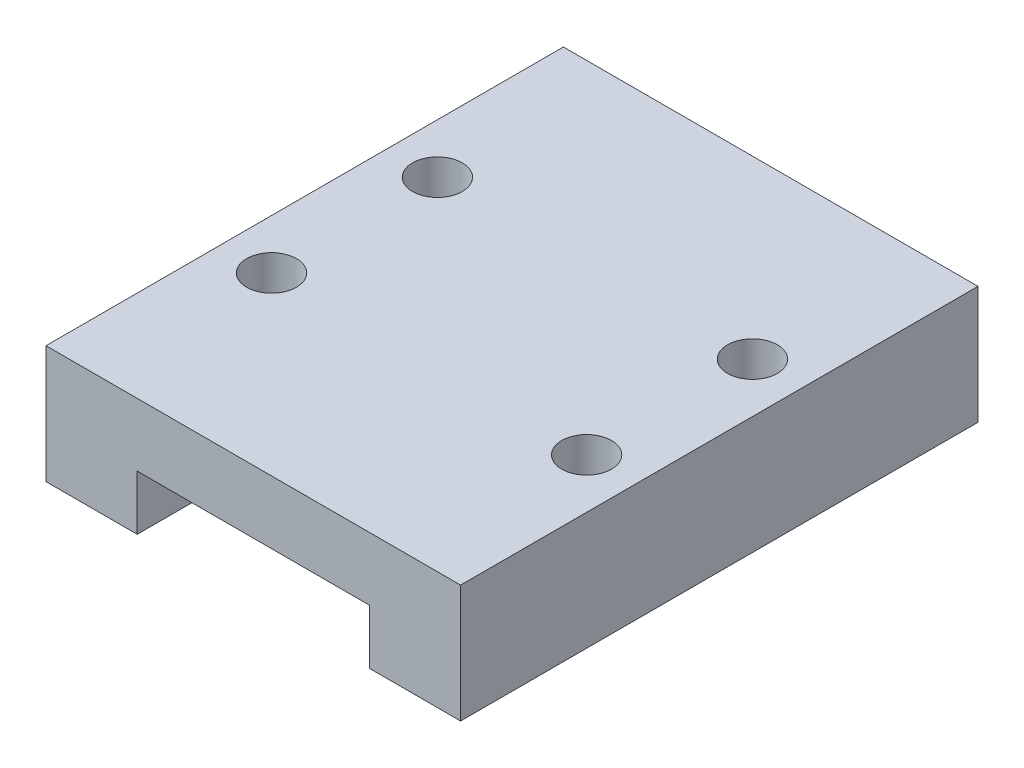
ISO-10303-21;
HEADER;
FILE_DESCRIPTION(('STEP AP214'),'2;1');
FILE_NAME('part.step','',(''),(''),'','','');
FILE_SCHEMA(('AUTOMOTIVE_DESIGN { 1 0 10303 214 1 1 1 1 }'));
ENDSEC;
DATA;
#1=APPLICATION_CONTEXT('core data for automotive mechanical design processes');
#2=APPLICATION_PROTOCOL_DEFINITION('international standard','automotive_design',2000,#1);
#3=PRODUCT_CONTEXT('',#1,'mechanical');
#4=PRODUCT('Part','Part','',(#3));
#5=PRODUCT_RELATED_PRODUCT_CATEGORY('part','',(#4));
#6=PRODUCT_DEFINITION_FORMATION('','',#4);
#7=PRODUCT_DEFINITION_CONTEXT('part definition',#1,'design');
#8=PRODUCT_DEFINITION('design','',#6,#7);
#9=PRODUCT_DEFINITION_SHAPE('','',#8);
#10=(LENGTH_UNIT() NAMED_UNIT(*) SI_UNIT(.MILLI.,.METRE.));
#11=(NAMED_UNIT(*) PLANE_ANGLE_UNIT() SI_UNIT($,.RADIAN.));
#12=(NAMED_UNIT(*) SI_UNIT($,.STERADIAN.) SOLID_ANGLE_UNIT());
#13=UNCERTAINTY_MEASURE_WITH_UNIT(LENGTH_MEASURE(1.E-05),#10,'distance_accuracy_value','');
#14=(GEOMETRIC_REPRESENTATION_CONTEXT(3) GLOBAL_UNCERTAINTY_ASSIGNED_CONTEXT((#13)) GLOBAL_UNIT_ASSIGNED_CONTEXT((#10,
#11,#12)) REPRESENTATION_CONTEXT('',''));
#15=CARTESIAN_POINT('',(0.,0.,0.));
#16=DIRECTION('',(0.,0.,1.));
#17=DIRECTION('',(1.,0.,0.));
#18=AXIS2_PLACEMENT_3D('',#15,#16,#17);
#19=CARTESIAN_POINT('',(-12.5,-3.55,15.6));
#20=DIRECTION('',(0.,1.,0.));
#21=DIRECTION('',(0.,0.,1.));
#22=AXIS2_PLACEMENT_3D('',#19,#20,#21);
#23=PLANE('',#22);
#24=DIRECTION('',(1.,0.,0.));
#25=VECTOR('',#24,1.);
#26=CARTESIAN_POINT('',(-12.5,-3.55,-15.6));
#27=LINE('',#26,#25);
#28=CARTESIAN_POINT('',(-12.5,-3.55,-15.6));
#29=VERTEX_POINT('',#28);
#30=CARTESIAN_POINT('',(-7.,-3.55,-15.6));
#31=VERTEX_POINT('',#30);
#32=EDGE_CURVE('E134',#29,#31,#27,.T.);
#33=ORIENTED_EDGE('',*,*,#32,.T.);
#34=DIRECTION('',(0.,0.,1.));
#35=VECTOR('',#34,1.);
#36=CARTESIAN_POINT('',(-7.,-3.55,-15.6));
#37=LINE('',#36,#35);
#38=CARTESIAN_POINT('',(-7.,-3.55,15.6));
#39=VERTEX_POINT('',#38);
#40=EDGE_CURVE('E116',#31,#39,#37,.T.);
#41=ORIENTED_EDGE('',*,*,#40,.T.);
#42=DIRECTION('',(1.,0.,0.));
#43=VECTOR('',#42,1.);
#44=CARTESIAN_POINT('',(-12.5,-3.55,15.6));
#45=LINE('',#44,#43);
#46=CARTESIAN_POINT('',(-12.5,-3.55,15.6));
#47=VERTEX_POINT('',#46);
#48=EDGE_CURVE('E156',#47,#39,#45,.T.);
#49=ORIENTED_EDGE('',*,*,#48,.F.);
#50=DIRECTION('',(0.,0.,-1.));
#51=VECTOR('',#50,1.);
#52=CARTESIAN_POINT('',(-12.5,-3.55,15.6));
#53=LINE('',#52,#51);
#54=EDGE_CURVE('E142',#47,#29,#53,.T.);
#55=ORIENTED_EDGE('',*,*,#54,.T.);
#56=EDGE_LOOP('',(#33,#41,#49,#55));
#57=FACE_BOUND('',#56,.T.);
#58=ADVANCED_FACE('F39',(#57),#23,.F.);
#59=CARTESIAN_POINT('',(12.5,-3.55,15.6));
#60=DIRECTION('',(-1.,0.,0.));
#61=DIRECTION('',(0.,0.,1.));
#62=AXIS2_PLACEMENT_3D('',#59,#60,#61);
#63=PLANE('',#62);
#64=DIRECTION('',(0.,1.,0.));
#65=VECTOR('',#64,1.);
#66=CARTESIAN_POINT('',(12.5,-3.55,-15.6));
#67=LINE('',#66,#65);
#68=CARTESIAN_POINT('',(12.5,-3.55,-15.6));
#69=VERTEX_POINT('',#68);
#70=CARTESIAN_POINT('',(12.5,3.55,-15.6));
#71=VERTEX_POINT('',#70);
#72=EDGE_CURVE('E168',#69,#71,#67,.T.);
#73=ORIENTED_EDGE('',*,*,#72,.T.);
#74=DIRECTION('',(0.,0.,-1.));
#75=VECTOR('',#74,1.);
#76=CARTESIAN_POINT('',(12.5,3.55,15.6));
#77=LINE('',#76,#75);
#78=CARTESIAN_POINT('',(12.5,3.55,15.6));
#79=VERTEX_POINT('',#78);
#80=EDGE_CURVE('E11',#79,#71,#77,.T.);
#81=ORIENTED_EDGE('',*,*,#80,.F.);
#82=DIRECTION('',(0.,1.,0.));
#83=VECTOR('',#82,1.);
#84=CARTESIAN_POINT('',(12.5,-3.55,15.6));
#85=LINE('',#84,#83);
#86=CARTESIAN_POINT('',(12.5,-3.55,15.6));
#87=VERTEX_POINT('',#86);
#88=EDGE_CURVE('E144',#87,#79,#85,.T.);
#89=ORIENTED_EDGE('',*,*,#88,.F.);
#90=DIRECTION('',(0.,0.,-1.));
#91=VECTOR('',#90,1.);
#92=CARTESIAN_POINT('',(12.5,-3.55,15.6));
#93=LINE('',#92,#91);
#94=EDGE_CURVE('E153',#87,#69,#93,.T.);
#95=ORIENTED_EDGE('',*,*,#94,.T.);
#96=EDGE_LOOP('',(#73,#81,#89,#95));
#97=FACE_BOUND('',#96,.T.);
#98=ADVANCED_FACE('F41',(#97),#63,.F.);
#99=CARTESIAN_POINT('',(-12.5,3.55,15.6));
#100=DIRECTION('',(0.,-1.,0.));
#101=DIRECTION('',(0.,0.,-1.));
#102=AXIS2_PLACEMENT_3D('',#99,#100,#101);
#103=PLANE('',#102);
#104=CARTESIAN_POINT('',(9.5,3.55,-5.));
#105=DIRECTION('',(0.,1.,0.));
#106=DIRECTION('',(0.,0.,1.));
#107=AXIS2_PLACEMENT_3D('',#104,#105,#106);
#108=CIRCLE('',#107,1.5);
#109=CARTESIAN_POINT('',(9.5,3.55,-3.5));
#110=VERTEX_POINT('',#109);
#111=EDGE_CURVE('E208',#110,#110,#108,.T.);
#112=ORIENTED_EDGE('',*,*,#111,.F.);
#113=EDGE_LOOP('',(#112));
#114=FACE_BOUND('',#113,.T.);
#115=CARTESIAN_POINT('',(-9.5,3.55,-5.));
#116=DIRECTION('',(0.,1.,0.));
#117=DIRECTION('',(0.,0.,1.));
#118=AXIS2_PLACEMENT_3D('',#115,#116,#117);
#119=CIRCLE('',#118,1.5);
#120=CARTESIAN_POINT('',(-9.5,3.55,-3.5));
#121=VERTEX_POINT('',#120);
#122=EDGE_CURVE('E216',#121,#121,#119,.T.);
#123=ORIENTED_EDGE('',*,*,#122,.F.);
#124=EDGE_LOOP('',(#123));
#125=FACE_BOUND('',#124,.T.);
#126=CARTESIAN_POINT('',(-9.5,3.55,5.));
#127=DIRECTION('',(0.,1.,0.));
#128=DIRECTION('',(0.,0.,1.));
#129=AXIS2_PLACEMENT_3D('',#126,#127,#128);
#130=CIRCLE('',#129,1.5);
#131=CARTESIAN_POINT('',(-9.5,3.55,6.5));
#132=VERTEX_POINT('',#131);
#133=EDGE_CURVE('E224',#132,#132,#130,.T.);
#134=ORIENTED_EDGE('',*,*,#133,.F.);
#135=EDGE_LOOP('',(#134));
#136=FACE_BOUND('',#135,.T.);
#137=CARTESIAN_POINT('',(9.5,3.55,5.));
#138=DIRECTION('',(0.,1.,0.));
#139=DIRECTION('',(0.,0.,1.));
#140=AXIS2_PLACEMENT_3D('',#137,#138,#139);
#141=CIRCLE('',#140,1.5);
#142=CARTESIAN_POINT('',(9.5,3.55,6.5));
#143=VERTEX_POINT('',#142);
#144=EDGE_CURVE('E200',#143,#143,#141,.T.);
#145=ORIENTED_EDGE('',*,*,#144,.F.);
#146=EDGE_LOOP('',(#145));
#147=FACE_BOUND('',#146,.T.);
#148=DIRECTION('',(-1.,0.,0.));
#149=VECTOR('',#148,1.);
#150=CARTESIAN_POINT('',(-12.5,3.55,-15.6));
#151=LINE('',#150,#149);
#152=CARTESIAN_POINT('',(-12.5,3.55,-15.6));
#153=VERTEX_POINT('',#152);
#154=EDGE_CURVE('E165',#71,#153,#151,.T.);
#155=ORIENTED_EDGE('',*,*,#154,.T.);
#156=DIRECTION('',(0.,0.,-1.));
#157=VECTOR('',#156,1.);
#158=CARTESIAN_POINT('',(-12.5,3.55,15.6));
#159=LINE('',#158,#157);
#160=CARTESIAN_POINT('',(-12.5,3.55,15.6));
#161=VERTEX_POINT('',#160);
#162=EDGE_CURVE('E48',#161,#153,#159,.T.);
#163=ORIENTED_EDGE('',*,*,#162,.F.);
#164=DIRECTION('',(-1.,0.,0.));
#165=VECTOR('',#164,1.);
#166=CARTESIAN_POINT('',(-12.5,3.55,15.6));
#167=LINE('',#166,#165);
#168=EDGE_CURVE('E93',#79,#161,#167,.T.);
#169=ORIENTED_EDGE('',*,*,#168,.F.);
#170=ORIENTED_EDGE('',*,*,#80,.T.);
#171=EDGE_LOOP('',(#155,#163,#169,#170));
#172=FACE_BOUND('',#171,.T.);
#173=ADVANCED_FACE('F241',(#114,#125,#136,#147,#172),#103,.F.);
#174=CARTESIAN_POINT('',(-12.5,-3.55,15.6));
#175=DIRECTION('',(1.,0.,0.));
#176=DIRECTION('',(0.,0.,-1.));
#177=AXIS2_PLACEMENT_3D('',#174,#175,#176);
#178=PLANE('',#177);
#179=DIRECTION('',(0.,-1.,0.));
#180=VECTOR('',#179,1.);
#181=CARTESIAN_POINT('',(-12.5,-3.55,-15.6));
#182=LINE('',#181,#180);
#183=EDGE_CURVE('E149',#153,#29,#182,.T.);
#184=ORIENTED_EDGE('',*,*,#183,.T.);
#185=ORIENTED_EDGE('',*,*,#54,.F.);
#186=DIRECTION('',(0.,-1.,0.));
#187=VECTOR('',#186,1.);
#188=CARTESIAN_POINT('',(-12.5,-3.55,15.6));
#189=LINE('',#188,#187);
#190=EDGE_CURVE('E163',#161,#47,#189,.T.);
#191=ORIENTED_EDGE('',*,*,#190,.F.);
#192=ORIENTED_EDGE('',*,*,#162,.T.);
#193=EDGE_LOOP('',(#184,#185,#191,#192));
#194=FACE_BOUND('',#193,.T.);
#195=ADVANCED_FACE('F162',(#194),#178,.F.);
#196=CARTESIAN_POINT('',(7.,-3.55,15.6));
#197=VERTEX_POINT('',#196);
#198=EDGE_CURVE('E64',#197,#87,#45,.T.);
#199=ORIENTED_EDGE('',*,*,#198,.F.);
#200=DIRECTION('',(0.,0.,1.));
#201=VECTOR('',#200,1.);
#202=CARTESIAN_POINT('',(7.,-3.55,-15.6));
#203=LINE('',#202,#201);
#204=CARTESIAN_POINT('',(7.,-3.55,-15.6));
#205=VERTEX_POINT('',#204);
#206=EDGE_CURVE('E128',#205,#197,#203,.T.);
#207=ORIENTED_EDGE('',*,*,#206,.F.);
#208=EDGE_CURVE('E86',#205,#69,#27,.T.);
#209=ORIENTED_EDGE('',*,*,#208,.T.);
#210=ORIENTED_EDGE('',*,*,#94,.F.);
#211=EDGE_LOOP('',(#199,#207,#209,#210));
#212=FACE_BOUND('',#211,.T.);
#213=ADVANCED_FACE('F265',(#212),#23,.F.);
#214=CARTESIAN_POINT('',(0.,0.,15.6));
#215=DIRECTION('',(0.,0.,-1.));
#216=DIRECTION('',(-1.,0.,0.));
#217=AXIS2_PLACEMENT_3D('',#214,#215,#216);
#218=PLANE('',#217);
#219=ORIENTED_EDGE('',*,*,#48,.T.);
#220=DIRECTION('',(0.,1.,0.));
#221=VECTOR('',#220,1.);
#222=CARTESIAN_POINT('',(-7.,0.,15.6));
#223=LINE('',#222,#221);
#224=CARTESIAN_POINT('',(-7.,-0.25,15.6));
#225=VERTEX_POINT('',#224);
#226=EDGE_CURVE('E122',#39,#225,#223,.T.);
#227=ORIENTED_EDGE('',*,*,#226,.T.);
#228=DIRECTION('',(1.,0.,0.));
#229=VECTOR('',#228,1.);
#230=CARTESIAN_POINT('',(0.,-0.25,15.6));
#231=LINE('',#230,#229);
#232=CARTESIAN_POINT('',(7.,-0.25,15.6));
#233=VERTEX_POINT('',#232);
#234=EDGE_CURVE('E181',#225,#233,#231,.T.);
#235=ORIENTED_EDGE('',*,*,#234,.T.);
#236=DIRECTION('',(0.,-1.,0.));
#237=VECTOR('',#236,1.);
#238=CARTESIAN_POINT('',(7.,0.,15.6));
#239=LINE('',#238,#237);
#240=EDGE_CURVE('E185',#233,#197,#239,.T.);
#241=ORIENTED_EDGE('',*,*,#240,.T.);
#242=ORIENTED_EDGE('',*,*,#198,.T.);
#243=ORIENTED_EDGE('',*,*,#88,.T.);
#244=ORIENTED_EDGE('',*,*,#168,.T.);
#245=ORIENTED_EDGE('',*,*,#190,.T.);
#246=EDGE_LOOP('',(#219,#227,#235,#241,#242,#243,#244,#245));
#247=FACE_BOUND('',#246,.T.);
#248=ADVANCED_FACE('F273',(#247),#218,.F.);
#249=CARTESIAN_POINT('',(0.,0.,-15.6));
#250=DIRECTION('',(0.,0.,-1.));
#251=DIRECTION('',(-1.,0.,0.));
#252=AXIS2_PLACEMENT_3D('',#249,#250,#251);
#253=PLANE('',#252);
#254=DIRECTION('',(0.,-1.,0.));
#255=VECTOR('',#254,1.);
#256=CARTESIAN_POINT('',(-7.,-3.55,-15.6));
#257=LINE('',#256,#255);
#258=CARTESIAN_POINT('',(-7.,-0.25,-15.6));
#259=VERTEX_POINT('',#258);
#260=EDGE_CURVE('E120',#259,#31,#257,.T.);
#261=ORIENTED_EDGE('',*,*,#260,.T.);
#262=ORIENTED_EDGE('',*,*,#32,.F.);
#263=ORIENTED_EDGE('',*,*,#183,.F.);
#264=ORIENTED_EDGE('',*,*,#154,.F.);
#265=ORIENTED_EDGE('',*,*,#72,.F.);
#266=ORIENTED_EDGE('',*,*,#208,.F.);
#267=DIRECTION('',(0.,1.,0.));
#268=VECTOR('',#267,1.);
#269=CARTESIAN_POINT('',(7.,-3.55,-15.6));
#270=LINE('',#269,#268);
#271=CARTESIAN_POINT('',(7.,-0.25,-15.6));
#272=VERTEX_POINT('',#271);
#273=EDGE_CURVE('E137',#205,#272,#270,.T.);
#274=ORIENTED_EDGE('',*,*,#273,.T.);
#275=DIRECTION('',(-1.,0.,0.));
#276=VECTOR('',#275,1.);
#277=CARTESIAN_POINT('',(-7.,-0.25,-15.6));
#278=LINE('',#277,#276);
#279=EDGE_CURVE('E55',#272,#259,#278,.T.);
#280=ORIENTED_EDGE('',*,*,#279,.T.);
#281=EDGE_LOOP('',(#261,#262,#263,#264,#265,#266,#274,#280));
#282=FACE_BOUND('',#281,.T.);
#283=ADVANCED_FACE('F132',(#282),#253,.T.);
#284=CARTESIAN_POINT('',(-7.,-3.55,-15.6));
#285=DIRECTION('',(-1.,0.,0.));
#286=DIRECTION('',(0.,0.,1.));
#287=AXIS2_PLACEMENT_3D('',#284,#285,#286);
#288=PLANE('',#287);
#289=ORIENTED_EDGE('',*,*,#40,.F.);
#290=ORIENTED_EDGE('',*,*,#260,.F.);
#291=DIRECTION('',(0.,0.,1.));
#292=VECTOR('',#291,1.);
#293=CARTESIAN_POINT('',(-7.,-0.25,-15.6));
#294=LINE('',#293,#292);
#295=EDGE_CURVE('E187',#259,#225,#294,.T.);
#296=ORIENTED_EDGE('',*,*,#295,.T.);
#297=ORIENTED_EDGE('',*,*,#226,.F.);
#298=EDGE_LOOP('',(#289,#290,#296,#297));
#299=FACE_BOUND('',#298,.T.);
#300=ADVANCED_FACE('F118',(#299),#288,.F.);
#301=CARTESIAN_POINT('',(-7.,-0.25,-15.6));
#302=DIRECTION('',(0.,1.,0.));
#303=DIRECTION('',(0.,0.,1.));
#304=AXIS2_PLACEMENT_3D('',#301,#302,#303);
#305=PLANE('',#304);
#306=ORIENTED_EDGE('',*,*,#295,.F.);
#307=ORIENTED_EDGE('',*,*,#279,.F.);
#308=DIRECTION('',(0.,0.,1.));
#309=VECTOR('',#308,1.);
#310=CARTESIAN_POINT('',(7.,-0.25,-15.6));
#311=LINE('',#310,#309);
#312=EDGE_CURVE('E191',#272,#233,#311,.T.);
#313=ORIENTED_EDGE('',*,*,#312,.T.);
#314=ORIENTED_EDGE('',*,*,#234,.F.);
#315=EDGE_LOOP('',(#306,#307,#313,#314));
#316=FACE_BOUND('',#315,.T.);
#317=ADVANCED_FACE('F258',(#316),#305,.F.);
#318=CARTESIAN_POINT('',(7.,-3.55,-15.6));
#319=DIRECTION('',(1.,0.,0.));
#320=DIRECTION('',(0.,1.,0.));
#321=AXIS2_PLACEMENT_3D('',#318,#319,#320);
#322=PLANE('',#321);
#323=ORIENTED_EDGE('',*,*,#312,.F.);
#324=ORIENTED_EDGE('',*,*,#273,.F.);
#325=ORIENTED_EDGE('',*,*,#206,.T.);
#326=ORIENTED_EDGE('',*,*,#240,.F.);
#327=EDGE_LOOP('',(#323,#324,#325,#326));
#328=FACE_BOUND('',#327,.T.);
#329=ADVANCED_FACE('F249',(#328),#322,.F.);
#330=CARTESIAN_POINT('',(9.5,0.55,5.));
#331=DIRECTION('',(0.,1.,0.));
#332=DIRECTION('',(0.,0.,1.));
#333=AXIS2_PLACEMENT_3D('',#330,#331,#332);
#334=CYLINDRICAL_SURFACE('',#333,1.5);
#335=CARTESIAN_POINT('',(9.5,0.55,5.));
#336=DIRECTION('',(0.,1.,0.));
#337=DIRECTION('',(0.,0.,1.));
#338=AXIS2_PLACEMENT_3D('',#335,#336,#337);
#339=CIRCLE('',#338,1.5);
#340=CARTESIAN_POINT('',(9.5,0.55,6.5));
#341=VERTEX_POINT('',#340);
#342=EDGE_CURVE('E138',#341,#341,#339,.T.);
#343=ORIENTED_EDGE('',*,*,#342,.F.);
#344=EDGE_LOOP('',(#343));
#345=FACE_BOUND('',#344,.T.);
#346=ORIENTED_EDGE('',*,*,#144,.T.);
#347=EDGE_LOOP('',(#346));
#348=FACE_BOUND('',#347,.T.);
#349=ADVANCED_FACE('F247',(#345,#348),#334,.F.);
#350=CARTESIAN_POINT('',(9.5,0.55,5.));
#351=DIRECTION('',(0.,1.,0.));
#352=DIRECTION('',(0.,0.,1.));
#353=AXIS2_PLACEMENT_3D('',#350,#351,#352);
#354=PLANE('',#353);
#355=ORIENTED_EDGE('',*,*,#342,.T.);
#356=EDGE_LOOP('',(#355));
#357=FACE_BOUND('',#356,.T.);
#358=ADVANCED_FACE('F237',(#357),#354,.T.);
#359=CARTESIAN_POINT('',(-9.5,0.55,5.));
#360=DIRECTION('',(0.,1.,0.));
#361=DIRECTION('',(0.,0.,1.));
#362=AXIS2_PLACEMENT_3D('',#359,#360,#361);
#363=CYLINDRICAL_SURFACE('',#362,1.5);
#364=CARTESIAN_POINT('',(-9.5,0.55,5.));
#365=DIRECTION('',(0.,1.,0.));
#366=DIRECTION('',(0.,0.,1.));
#367=AXIS2_PLACEMENT_3D('',#364,#365,#366);
#368=CIRCLE('',#367,1.5);
#369=CARTESIAN_POINT('',(-9.5,0.55,6.5));
#370=VERTEX_POINT('',#369);
#371=EDGE_CURVE('E204',#370,#370,#368,.T.);
#372=ORIENTED_EDGE('',*,*,#371,.F.);
#373=EDGE_LOOP('',(#372));
#374=FACE_BOUND('',#373,.T.);
#375=ORIENTED_EDGE('',*,*,#133,.T.);
#376=EDGE_LOOP('',(#375));
#377=FACE_BOUND('',#376,.T.);
#378=ADVANCED_FACE('F234',(#374,#377),#363,.F.);
#379=CARTESIAN_POINT('',(-9.5,0.55,5.));
#380=DIRECTION('',(0.,1.,0.));
#381=DIRECTION('',(0.,0.,1.));
#382=AXIS2_PLACEMENT_3D('',#379,#380,#381);
#383=PLANE('',#382);
#384=ORIENTED_EDGE('',*,*,#371,.T.);
#385=EDGE_LOOP('',(#384));
#386=FACE_BOUND('',#385,.T.);
#387=ADVANCED_FACE('F232',(#386),#383,.T.);
#388=CARTESIAN_POINT('',(-9.5,0.55,-5.));
#389=DIRECTION('',(0.,1.,0.));
#390=DIRECTION('',(0.,0.,1.));
#391=AXIS2_PLACEMENT_3D('',#388,#389,#390);
#392=CYLINDRICAL_SURFACE('',#391,1.5);
#393=CARTESIAN_POINT('',(-9.5,0.55,-5.));
#394=DIRECTION('',(0.,1.,0.));
#395=DIRECTION('',(0.,0.,1.));
#396=AXIS2_PLACEMENT_3D('',#393,#394,#395);
#397=CIRCLE('',#396,1.5);
#398=CARTESIAN_POINT('',(-9.5,0.55,-3.5));
#399=VERTEX_POINT('',#398);
#400=EDGE_CURVE('E220',#399,#399,#397,.T.);
#401=ORIENTED_EDGE('',*,*,#400,.F.);
#402=EDGE_LOOP('',(#401));
#403=FACE_BOUND('',#402,.T.);
#404=ORIENTED_EDGE('',*,*,#122,.T.);
#405=EDGE_LOOP('',(#404));
#406=FACE_BOUND('',#405,.T.);
#407=ADVANCED_FACE('F340',(#403,#406),#392,.F.);
#408=CARTESIAN_POINT('',(-9.5,0.55,-5.));
#409=DIRECTION('',(0.,1.,0.));
#410=DIRECTION('',(0.,0.,1.));
#411=AXIS2_PLACEMENT_3D('',#408,#409,#410);
#412=PLANE('',#411);
#413=ORIENTED_EDGE('',*,*,#400,.T.);
#414=EDGE_LOOP('',(#413));
#415=FACE_BOUND('',#414,.T.);
#416=ADVANCED_FACE('F349',(#415),#412,.T.);
#417=CARTESIAN_POINT('',(9.5,0.55,-5.));
#418=DIRECTION('',(0.,1.,0.));
#419=DIRECTION('',(0.,0.,1.));
#420=AXIS2_PLACEMENT_3D('',#417,#418,#419);
#421=CYLINDRICAL_SURFACE('',#420,1.5);
#422=CARTESIAN_POINT('',(9.5,0.55,-5.));
#423=DIRECTION('',(0.,1.,0.));
#424=DIRECTION('',(0.,0.,1.));
#425=AXIS2_PLACEMENT_3D('',#422,#423,#424);
#426=CIRCLE('',#425,1.5);
#427=CARTESIAN_POINT('',(9.5,0.55,-3.5));
#428=VERTEX_POINT('',#427);
#429=EDGE_CURVE('E212',#428,#428,#426,.T.);
#430=ORIENTED_EDGE('',*,*,#429,.F.);
#431=EDGE_LOOP('',(#430));
#432=FACE_BOUND('',#431,.T.);
#433=ORIENTED_EDGE('',*,*,#111,.T.);
#434=EDGE_LOOP('',(#433));
#435=FACE_BOUND('',#434,.T.);
#436=ADVANCED_FACE('F359',(#432,#435),#421,.F.);
#437=CARTESIAN_POINT('',(9.5,0.55,-5.));
#438=DIRECTION('',(0.,1.,0.));
#439=DIRECTION('',(0.,0.,1.));
#440=AXIS2_PLACEMENT_3D('',#437,#438,#439);
#441=PLANE('',#440);
#442=ORIENTED_EDGE('',*,*,#429,.T.);
#443=EDGE_LOOP('',(#442));
#444=FACE_BOUND('',#443,.T.);
#445=ADVANCED_FACE('F369',(#444),#441,.T.);
#446=CLOSED_SHELL('',(#58,#98,#173,#195,#213,#248,#283,#300,#317,#329,#349,#358,#378,#387,#407,
#416,#436,#445));
#447=MANIFOLD_SOLID_BREP('B2',#446);
#448=ADVANCED_BREP_SHAPE_REPRESENTATION('',(#18,#447),#14);
#449=SHAPE_DEFINITION_REPRESENTATION(#9,#448);
ENDSEC;
END-ISO-10303-21;
